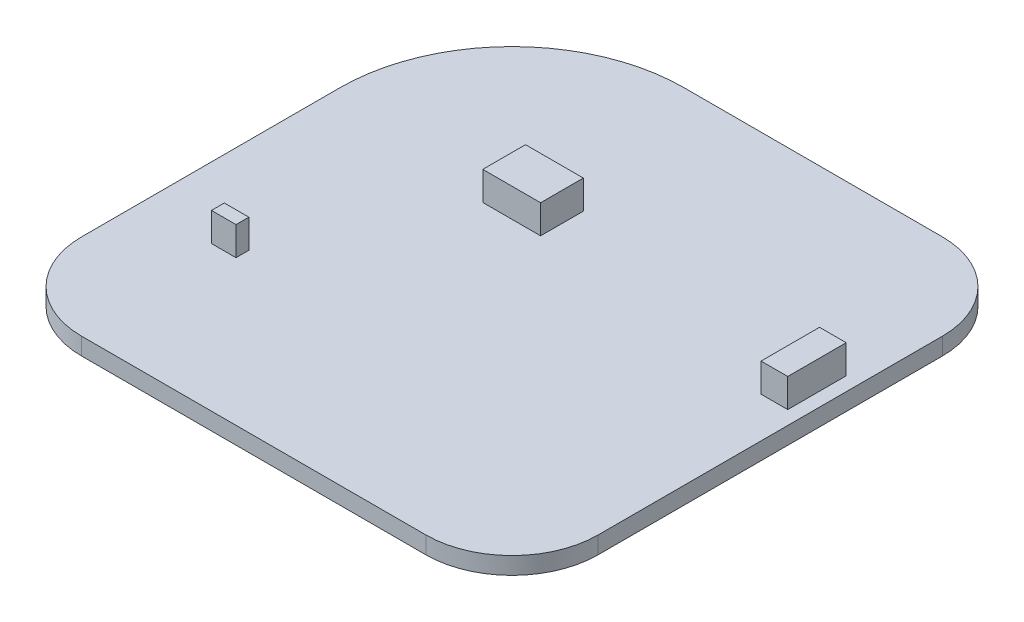
ISO-10303-21;
HEADER;
FILE_DESCRIPTION(('STEP AP214'),'2;1');
FILE_NAME('part.step','',(''),(''),'','','');
FILE_SCHEMA(('AUTOMOTIVE_DESIGN { 1 0 10303 214 1 1 1 1 }'));
ENDSEC;
DATA;
#1=APPLICATION_CONTEXT('core data for automotive mechanical design processes');
#2=APPLICATION_PROTOCOL_DEFINITION('international standard','automotive_design',2000,#1);
#3=PRODUCT_CONTEXT('',#1,'mechanical');
#4=PRODUCT('Part','Part','',(#3));
#5=PRODUCT_RELATED_PRODUCT_CATEGORY('part','',(#4));
#6=PRODUCT_DEFINITION_FORMATION('','',#4);
#7=PRODUCT_DEFINITION_CONTEXT('part definition',#1,'design');
#8=PRODUCT_DEFINITION('design','',#6,#7);
#9=PRODUCT_DEFINITION_SHAPE('','',#8);
#10=(LENGTH_UNIT() NAMED_UNIT(*) SI_UNIT(.MILLI.,.METRE.));
#11=(NAMED_UNIT(*) PLANE_ANGLE_UNIT() SI_UNIT($,.RADIAN.));
#12=(NAMED_UNIT(*) SI_UNIT($,.STERADIAN.) SOLID_ANGLE_UNIT());
#13=UNCERTAINTY_MEASURE_WITH_UNIT(LENGTH_MEASURE(1.E-05),#10,'distance_accuracy_value','');
#14=(GEOMETRIC_REPRESENTATION_CONTEXT(3) GLOBAL_UNCERTAINTY_ASSIGNED_CONTEXT((#13)) GLOBAL_UNIT_ASSIGNED_CONTEXT((#10,
#11,#12)) REPRESENTATION_CONTEXT('',''));
#15=CARTESIAN_POINT('',(0.,0.,0.));
#16=DIRECTION('',(0.,0.,1.));
#17=DIRECTION('',(1.,0.,0.));
#18=AXIS2_PLACEMENT_3D('',#15,#16,#17);
#19=CARTESIAN_POINT('',(-8.95373992154277,1.9,-8.95373992154277));
#20=DIRECTION('',(0.,1.,0.));
#21=DIRECTION('',(0.,0.,1.));
#22=AXIS2_PLACEMENT_3D('',#19,#20,#21);
#23=PLANE('',#22);
#24=CARTESIAN_POINT('',(-8.95373992154277,1.9,-8.95373992154277));
#25=DIRECTION('',(0.,1.,0.));
#26=DIRECTION('',(0.,0.,1.));
#27=AXIS2_PLACEMENT_3D('',#24,#25,#26);
#28=CIRCLE('',#27,18.);
#29=CARTESIAN_POINT('',(-8.95373992154277,1.9,-26.9537399215428));
#30=VERTEX_POINT('',#29);
#31=CARTESIAN_POINT('',(-26.9537399215428,1.9,-8.95373992154277));
#32=VERTEX_POINT('',#31);
#33=EDGE_CURVE('E272',#30,#32,#28,.T.);
#34=ORIENTED_EDGE('',*,*,#33,.T.);
#35=DIRECTION('',(0.,0.,1.));
#36=VECTOR('',#35,1.);
#37=CARTESIAN_POINT('',(-26.9537399215428,1.9,-8.95373992154277));
#38=LINE('',#37,#36);
#39=CARTESIAN_POINT('',(-26.9537399215428,1.9,18.0462600784572));
#40=VERTEX_POINT('',#39);
#41=EDGE_CURVE('E275',#32,#40,#38,.T.);
#42=ORIENTED_EDGE('',*,*,#41,.T.);
#43=CARTESIAN_POINT('',(-17.9537399215428,1.9,18.0462600784572));
#44=DIRECTION('',(0.,1.,0.));
#45=DIRECTION('',(0.,0.,1.));
#46=AXIS2_PLACEMENT_3D('',#43,#44,#45);
#47=CIRCLE('',#46,9.);
#48=CARTESIAN_POINT('',(-17.9537399215428,1.9,27.0462600784572));
#49=VERTEX_POINT('',#48);
#50=EDGE_CURVE('E278',#40,#49,#47,.T.);
#51=ORIENTED_EDGE('',*,*,#50,.T.);
#52=DIRECTION('',(1.,0.,0.));
#53=VECTOR('',#52,1.);
#54=CARTESIAN_POINT('',(-17.9537399215428,1.9,27.0462600784572));
#55=LINE('',#54,#53);
#56=CARTESIAN_POINT('',(18.0462600784572,1.9,27.0462600784572));
#57=VERTEX_POINT('',#56);
#58=EDGE_CURVE('E280',#49,#57,#55,.T.);
#59=ORIENTED_EDGE('',*,*,#58,.T.);
#60=CARTESIAN_POINT('',(18.0462600784572,1.9,18.0462600784572));
#61=DIRECTION('',(0.,1.,0.));
#62=DIRECTION('',(0.,0.,1.));
#63=AXIS2_PLACEMENT_3D('',#60,#61,#62);
#64=CIRCLE('',#63,8.99999999999999);
#65=CARTESIAN_POINT('',(27.0462600784572,1.9,18.0462600784572));
#66=VERTEX_POINT('',#65);
#67=EDGE_CURVE('E282',#57,#66,#64,.T.);
#68=ORIENTED_EDGE('',*,*,#67,.T.);
#69=DIRECTION('',(0.,0.,-1.));
#70=VECTOR('',#69,1.);
#71=CARTESIAN_POINT('',(27.0462600784572,1.9,-17.9537399215428));
#72=LINE('',#71,#70);
#73=CARTESIAN_POINT('',(27.0462600784572,1.9,-17.9537399215428));
#74=VERTEX_POINT('',#73);
#75=EDGE_CURVE('E284',#66,#74,#72,.T.);
#76=ORIENTED_EDGE('',*,*,#75,.T.);
#77=CARTESIAN_POINT('',(18.0462600784572,1.9,-17.9537399215428));
#78=DIRECTION('',(0.,1.,0.));
#79=DIRECTION('',(0.,0.,-1.));
#80=AXIS2_PLACEMENT_3D('',#77,#78,#79);
#81=CIRCLE('',#80,9.);
#82=CARTESIAN_POINT('',(18.0462600784572,1.9,-26.9537399215428));
#83=VERTEX_POINT('',#82);
#84=EDGE_CURVE('E286',#74,#83,#81,.T.);
#85=ORIENTED_EDGE('',*,*,#84,.T.);
#86=DIRECTION('',(-1.,0.,0.));
#87=VECTOR('',#86,1.);
#88=CARTESIAN_POINT('',(-8.95373992154277,1.9,-26.9537399215428));
#89=LINE('',#88,#87);
#90=EDGE_CURVE('E288',#83,#30,#89,.T.);
#91=ORIENTED_EDGE('',*,*,#90,.T.);
#92=EDGE_LOOP('',(#34,#42,#51,#59,#68,#76,#85,#91));
#93=FACE_BOUND('',#92,.T.);
#94=DIRECTION('',(-1.,0.,0.));
#95=VECTOR('',#94,1.);
#96=CARTESIAN_POINT('',(-3.04533557556397,1.9,-10.5049180389187));
#97=LINE('',#96,#95);
#98=CARTESIAN_POINT('',(-3.04533557556397,1.9,-10.5049180389187));
#99=VERTEX_POINT('',#98);
#100=CARTESIAN_POINT('',(-9.09211478915495,1.9,-10.5049180389187));
#101=VERTEX_POINT('',#100);
#102=EDGE_CURVE('E256',#99,#101,#97,.T.);
#103=ORIENTED_EDGE('',*,*,#102,.F.);
#104=DIRECTION('',(0.,0.,-1.));
#105=VECTOR('',#104,1.);
#106=CARTESIAN_POINT('',(-3.04533557556397,1.9,-10.5049180389187));
#107=LINE('',#106,#105);
#108=CARTESIAN_POINT('',(-3.04533557556397,1.9,-6.0361416342829));
#109=VERTEX_POINT('',#108);
#110=EDGE_CURVE('E242',#109,#99,#107,.T.);
#111=ORIENTED_EDGE('',*,*,#110,.F.);
#112=DIRECTION('',(1.,0.,0.));
#113=VECTOR('',#112,1.);
#114=CARTESIAN_POINT('',(-3.04533557556397,1.9,-6.0361416342829));
#115=LINE('',#114,#113);
#116=CARTESIAN_POINT('',(-9.09211478915495,1.9,-6.0361416342829));
#117=VERTEX_POINT('',#116);
#118=EDGE_CURVE('E247',#117,#109,#115,.T.);
#119=ORIENTED_EDGE('',*,*,#118,.F.);
#120=DIRECTION('',(0.,0.,1.));
#121=VECTOR('',#120,1.);
#122=CARTESIAN_POINT('',(-9.09211478915495,1.9,-10.5049180389187));
#123=LINE('',#122,#121);
#124=EDGE_CURVE('E258',#101,#117,#123,.T.);
#125=ORIENTED_EDGE('',*,*,#124,.F.);
#126=EDGE_LOOP('',(#103,#111,#119,#125));
#127=FACE_BOUND('',#126,.T.);
#128=DIRECTION('',(-1.,0.,0.));
#129=VECTOR('',#128,1.);
#130=CARTESIAN_POINT('',(25.6075071904434,1.9,-9.33895941673768));
#131=LINE('',#130,#129);
#132=CARTESIAN_POINT('',(25.6075071904434,1.9,-9.33895941673768));
#133=VERTEX_POINT('',#132);
#134=CARTESIAN_POINT('',(22.8171096144365,1.9,-9.33895941673768));
#135=VERTEX_POINT('',#134);
#136=EDGE_CURVE('E214',#133,#135,#131,.T.);
#137=ORIENTED_EDGE('',*,*,#136,.F.);
#138=DIRECTION('',(0.,0.,-1.));
#139=VECTOR('',#138,1.);
#140=CARTESIAN_POINT('',(25.6075071904434,1.9,-9.33895941673768));
#141=LINE('',#140,#139);
#142=CARTESIAN_POINT('',(25.6075071904434,1.9,-3.2235961309226));
#143=VERTEX_POINT('',#142);
#144=EDGE_CURVE('E211',#143,#133,#141,.T.);
#145=ORIENTED_EDGE('',*,*,#144,.F.);
#146=DIRECTION('',(1.,0.,0.));
#147=VECTOR('',#146,1.);
#148=CARTESIAN_POINT('',(25.6075071904434,1.9,-3.2235961309226));
#149=LINE('',#148,#147);
#150=CARTESIAN_POINT('',(22.8171096144365,1.9,-3.2235961309226));
#151=VERTEX_POINT('',#150);
#152=EDGE_CURVE('E223',#151,#143,#149,.T.);
#153=ORIENTED_EDGE('',*,*,#152,.F.);
#154=DIRECTION('',(0.,0.,1.));
#155=VECTOR('',#154,1.);
#156=CARTESIAN_POINT('',(22.8171096144365,1.9,-9.33895941673768));
#157=LINE('',#156,#155);
#158=EDGE_CURVE('E231',#135,#151,#157,.T.);
#159=ORIENTED_EDGE('',*,*,#158,.F.);
#160=EDGE_LOOP('',(#137,#145,#153,#159));
#161=FACE_BOUND('',#160,.T.);
#162=DIRECTION('',(1.,0.,0.));
#163=VECTOR('',#162,1.);
#164=CARTESIAN_POINT('',(-19.5587865009088,1.9,11.8699083065934));
#165=LINE('',#164,#163);
#166=CARTESIAN_POINT('',(-19.5587865009088,1.9,11.8699083065934));
#167=VERTEX_POINT('',#166);
#168=CARTESIAN_POINT('',(-16.992674790913,1.9,11.8699083065934));
#169=VERTEX_POINT('',#168);
#170=EDGE_CURVE('E591',#167,#169,#165,.T.);
#171=ORIENTED_EDGE('',*,*,#170,.F.);
#172=DIRECTION('',(0.,0.,1.));
#173=VECTOR('',#172,1.);
#174=CARTESIAN_POINT('',(-19.5587865009088,1.9,10.5237147181043));
#175=LINE('',#174,#173);
#176=CARTESIAN_POINT('',(-19.5587865009088,1.9,10.5237147181043));
#177=VERTEX_POINT('',#176);
#178=EDGE_CURVE('E209',#177,#167,#175,.T.);
#179=ORIENTED_EDGE('',*,*,#178,.F.);
#180=DIRECTION('',(-1.,0.,0.));
#181=VECTOR('',#180,1.);
#182=CARTESIAN_POINT('',(-19.5587865009088,1.9,10.5237147181043));
#183=LINE('',#182,#181);
#184=CARTESIAN_POINT('',(-16.992674790913,1.9,10.5237147181043));
#185=VERTEX_POINT('',#184);
#186=EDGE_CURVE('E205',#185,#177,#183,.T.);
#187=ORIENTED_EDGE('',*,*,#186,.F.);
#188=DIRECTION('',(0.,0.,-1.));
#189=VECTOR('',#188,1.);
#190=CARTESIAN_POINT('',(-16.992674790913,1.9,10.5237147181043));
#191=LINE('',#190,#189);
#192=EDGE_CURVE('E588',#169,#185,#191,.T.);
#193=ORIENTED_EDGE('',*,*,#192,.F.);
#194=EDGE_LOOP('',(#171,#179,#187,#193));
#195=FACE_BOUND('',#194,.T.);
#196=ADVANCED_FACE('F48',(#93,#127,#161,#195),#23,.T.);
#197=CARTESIAN_POINT('',(-8.95373992154277,1.9,-8.95373992154277));
#198=DIRECTION('',(0.,-1.,0.));
#199=DIRECTION('',(0.,0.,-1.));
#200=AXIS2_PLACEMENT_3D('',#197,#198,#199);
#201=CYLINDRICAL_SURFACE('',#200,18.);
#202=CARTESIAN_POINT('',(-8.95373992154277,0.1,-8.95373992154277));
#203=DIRECTION('',(0.,1.,0.));
#204=DIRECTION('',(0.,0.,1.));
#205=AXIS2_PLACEMENT_3D('',#202,#203,#204);
#206=CIRCLE('',#205,18.);
#207=CARTESIAN_POINT('',(-8.95373992154277,0.1,-26.9537399215428));
#208=VERTEX_POINT('',#207);
#209=CARTESIAN_POINT('',(-26.9537399215428,0.1,-8.95373992154277));
#210=VERTEX_POINT('',#209);
#211=EDGE_CURVE('E271',#208,#210,#206,.T.);
#212=ORIENTED_EDGE('',*,*,#211,.T.);
#213=DIRECTION('',(0.,-1.,0.));
#214=VECTOR('',#213,1.);
#215=CARTESIAN_POINT('',(-26.9537399215428,1.9,-8.95373992154277));
#216=LINE('',#215,#214);
#217=EDGE_CURVE('E13',#32,#210,#216,.T.);
#218=ORIENTED_EDGE('',*,*,#217,.F.);
#219=ORIENTED_EDGE('',*,*,#33,.F.);
#220=DIRECTION('',(0.,-1.,0.));
#221=VECTOR('',#220,1.);
#222=CARTESIAN_POINT('',(-8.95373992154277,1.9,-26.9537399215428));
#223=LINE('',#222,#221);
#224=EDGE_CURVE('E290',#30,#208,#223,.T.);
#225=ORIENTED_EDGE('',*,*,#224,.T.);
#226=EDGE_LOOP('',(#212,#218,#219,#225));
#227=FACE_BOUND('',#226,.T.);
#228=ADVANCED_FACE('F50',(#227),#201,.T.);
#229=CARTESIAN_POINT('',(-26.9537399215428,1.9,-8.95373992154277));
#230=DIRECTION('',(1.,0.,0.));
#231=DIRECTION('',(0.,0.,-1.));
#232=AXIS2_PLACEMENT_3D('',#229,#230,#231);
#233=PLANE('',#232);
#234=DIRECTION('',(0.,0.,1.));
#235=VECTOR('',#234,1.);
#236=CARTESIAN_POINT('',(-26.9537399215428,0.1,-8.95373992154277));
#237=LINE('',#236,#235);
#238=CARTESIAN_POINT('',(-26.9537399215428,0.1,18.0462600784572));
#239=VERTEX_POINT('',#238);
#240=EDGE_CURVE('E293',#210,#239,#237,.T.);
#241=ORIENTED_EDGE('',*,*,#240,.T.);
#242=DIRECTION('',(0.,-1.,0.));
#243=VECTOR('',#242,1.);
#244=CARTESIAN_POINT('',(-26.9537399215428,1.9,18.0462600784572));
#245=LINE('',#244,#243);
#246=EDGE_CURVE('E56',#40,#239,#245,.T.);
#247=ORIENTED_EDGE('',*,*,#246,.F.);
#248=ORIENTED_EDGE('',*,*,#41,.F.);
#249=ORIENTED_EDGE('',*,*,#217,.T.);
#250=EDGE_LOOP('',(#241,#247,#248,#249));
#251=FACE_BOUND('',#250,.T.);
#252=ADVANCED_FACE('F350',(#251),#233,.F.);
#253=CARTESIAN_POINT('',(-17.9537399215428,1.9,18.0462600784572));
#254=DIRECTION('',(0.,-1.,0.));
#255=DIRECTION('',(0.,0.,-1.));
#256=AXIS2_PLACEMENT_3D('',#253,#254,#255);
#257=CYLINDRICAL_SURFACE('',#256,9.);
#258=CARTESIAN_POINT('',(-17.9537399215428,0.1,18.0462600784572));
#259=DIRECTION('',(0.,1.,0.));
#260=DIRECTION('',(0.,0.,1.));
#261=AXIS2_PLACEMENT_3D('',#258,#259,#260);
#262=CIRCLE('',#261,9.);
#263=CARTESIAN_POINT('',(-17.9537399215428,0.1,27.0462600784572));
#264=VERTEX_POINT('',#263);
#265=EDGE_CURVE('E295',#239,#264,#262,.T.);
#266=ORIENTED_EDGE('',*,*,#265,.T.);
#267=DIRECTION('',(0.,-1.,0.));
#268=VECTOR('',#267,1.);
#269=CARTESIAN_POINT('',(-17.9537399215428,1.9,27.0462600784572));
#270=LINE('',#269,#268);
#271=EDGE_CURVE('E320',#49,#264,#270,.T.);
#272=ORIENTED_EDGE('',*,*,#271,.F.);
#273=ORIENTED_EDGE('',*,*,#50,.F.);
#274=ORIENTED_EDGE('',*,*,#246,.T.);
#275=EDGE_LOOP('',(#266,#272,#273,#274));
#276=FACE_BOUND('',#275,.T.);
#277=ADVANCED_FACE('F327',(#276),#257,.T.);
#278=CARTESIAN_POINT('',(-17.9537399215428,1.9,27.0462600784572));
#279=DIRECTION('',(0.,0.,-1.));
#280=DIRECTION('',(-1.,0.,0.));
#281=AXIS2_PLACEMENT_3D('',#278,#279,#280);
#282=PLANE('',#281);
#283=DIRECTION('',(1.,0.,0.));
#284=VECTOR('',#283,1.);
#285=CARTESIAN_POINT('',(-17.9537399215428,0.1,27.0462600784572));
#286=LINE('',#285,#284);
#287=CARTESIAN_POINT('',(18.0462600784572,0.1,27.0462600784572));
#288=VERTEX_POINT('',#287);
#289=EDGE_CURVE('E297',#264,#288,#286,.T.);
#290=ORIENTED_EDGE('',*,*,#289,.T.);
#291=DIRECTION('',(0.,-1.,0.));
#292=VECTOR('',#291,1.);
#293=CARTESIAN_POINT('',(18.0462600784572,1.9,27.0462600784572));
#294=LINE('',#293,#292);
#295=EDGE_CURVE('E317',#57,#288,#294,.T.);
#296=ORIENTED_EDGE('',*,*,#295,.F.);
#297=ORIENTED_EDGE('',*,*,#58,.F.);
#298=ORIENTED_EDGE('',*,*,#271,.T.);
#299=EDGE_LOOP('',(#290,#296,#297,#298));
#300=FACE_BOUND('',#299,.T.);
#301=ADVANCED_FACE('F338',(#300),#282,.F.);
#302=CARTESIAN_POINT('',(18.0462600784572,1.9,18.0462600784572));
#303=DIRECTION('',(0.,-1.,0.));
#304=DIRECTION('',(0.,0.,-1.));
#305=AXIS2_PLACEMENT_3D('',#302,#303,#304);
#306=CYLINDRICAL_SURFACE('',#305,8.99999999999999);
#307=CARTESIAN_POINT('',(18.0462600784572,0.1,18.0462600784572));
#308=DIRECTION('',(0.,1.,0.));
#309=DIRECTION('',(0.,0.,1.));
#310=AXIS2_PLACEMENT_3D('',#307,#308,#309);
#311=CIRCLE('',#310,8.99999999999999);
#312=CARTESIAN_POINT('',(27.0462600784572,0.1,18.0462600784572));
#313=VERTEX_POINT('',#312);
#314=EDGE_CURVE('E299',#288,#313,#311,.T.);
#315=ORIENTED_EDGE('',*,*,#314,.T.);
#316=DIRECTION('',(0.,-1.,0.));
#317=VECTOR('',#316,1.);
#318=CARTESIAN_POINT('',(27.0462600784572,1.9,18.0462600784572));
#319=LINE('',#318,#317);
#320=EDGE_CURVE('E314',#66,#313,#319,.T.);
#321=ORIENTED_EDGE('',*,*,#320,.F.);
#322=ORIENTED_EDGE('',*,*,#67,.F.);
#323=ORIENTED_EDGE('',*,*,#295,.T.);
#324=EDGE_LOOP('',(#315,#321,#322,#323));
#325=FACE_BOUND('',#324,.T.);
#326=ADVANCED_FACE('F342',(#325),#306,.T.);
#327=CARTESIAN_POINT('',(27.0462600784572,1.9,-17.9537399215428));
#328=DIRECTION('',(-1.,0.,0.));
#329=DIRECTION('',(0.,0.,1.));
#330=AXIS2_PLACEMENT_3D('',#327,#328,#329);
#331=PLANE('',#330);
#332=DIRECTION('',(0.,0.,-1.));
#333=VECTOR('',#332,1.);
#334=CARTESIAN_POINT('',(27.0462600784572,0.1,-17.9537399215428));
#335=LINE('',#334,#333);
#336=CARTESIAN_POINT('',(27.0462600784572,0.1,-17.9537399215428));
#337=VERTEX_POINT('',#336);
#338=EDGE_CURVE('E301',#313,#337,#335,.T.);
#339=ORIENTED_EDGE('',*,*,#338,.T.);
#340=DIRECTION('',(0.,-1.,0.));
#341=VECTOR('',#340,1.);
#342=CARTESIAN_POINT('',(27.0462600784572,1.9,-17.9537399215428));
#343=LINE('',#342,#341);
#344=EDGE_CURVE('E311',#74,#337,#343,.T.);
#345=ORIENTED_EDGE('',*,*,#344,.F.);
#346=ORIENTED_EDGE('',*,*,#75,.F.);
#347=ORIENTED_EDGE('',*,*,#320,.T.);
#348=EDGE_LOOP('',(#339,#345,#346,#347));
#349=FACE_BOUND('',#348,.T.);
#350=ADVANCED_FACE('F363',(#349),#331,.F.);
#351=CARTESIAN_POINT('',(18.0462600784572,1.9,-17.9537399215428));
#352=DIRECTION('',(0.,-1.,0.));
#353=DIRECTION('',(0.,0.,-1.));
#354=AXIS2_PLACEMENT_3D('',#351,#352,#353);
#355=CYLINDRICAL_SURFACE('',#354,9.);
#356=CARTESIAN_POINT('',(18.0462600784572,0.1,-17.9537399215428));
#357=DIRECTION('',(0.,1.,0.));
#358=DIRECTION('',(0.,0.,-1.));
#359=AXIS2_PLACEMENT_3D('',#356,#357,#358);
#360=CIRCLE('',#359,9.);
#361=CARTESIAN_POINT('',(18.0462600784572,0.1,-26.9537399215428));
#362=VERTEX_POINT('',#361);
#363=EDGE_CURVE('E303',#337,#362,#360,.T.);
#364=ORIENTED_EDGE('',*,*,#363,.T.);
#365=DIRECTION('',(0.,-1.,0.));
#366=VECTOR('',#365,1.);
#367=CARTESIAN_POINT('',(18.0462600784572,1.9,-26.9537399215428));
#368=LINE('',#367,#366);
#369=EDGE_CURVE('E308',#83,#362,#368,.T.);
#370=ORIENTED_EDGE('',*,*,#369,.F.);
#371=ORIENTED_EDGE('',*,*,#84,.F.);
#372=ORIENTED_EDGE('',*,*,#344,.T.);
#373=EDGE_LOOP('',(#364,#370,#371,#372));
#374=FACE_BOUND('',#373,.T.);
#375=ADVANCED_FACE('F361',(#374),#355,.T.);
#376=CARTESIAN_POINT('',(-8.95373992154277,1.9,-26.9537399215428));
#377=DIRECTION('',(0.,0.,1.));
#378=DIRECTION('',(1.,0.,0.));
#379=AXIS2_PLACEMENT_3D('',#376,#377,#378);
#380=PLANE('',#379);
#381=DIRECTION('',(-1.,0.,0.));
#382=VECTOR('',#381,1.);
#383=CARTESIAN_POINT('',(-8.95373992154277,0.1,-26.9537399215428));
#384=LINE('',#383,#382);
#385=EDGE_CURVE('E276',#362,#208,#384,.T.);
#386=ORIENTED_EDGE('',*,*,#385,.T.);
#387=ORIENTED_EDGE('',*,*,#224,.F.);
#388=ORIENTED_EDGE('',*,*,#90,.F.);
#389=ORIENTED_EDGE('',*,*,#369,.T.);
#390=EDGE_LOOP('',(#386,#387,#388,#389));
#391=FACE_BOUND('',#390,.T.);
#392=ADVANCED_FACE('F356',(#391),#380,.F.);
#393=CARTESIAN_POINT('',(-8.95373992154277,0.1,-8.95373992154277));
#394=DIRECTION('',(0.,1.,0.));
#395=DIRECTION('',(0.,0.,1.));
#396=AXIS2_PLACEMENT_3D('',#393,#394,#395);
#397=PLANE('',#396);
#398=ORIENTED_EDGE('',*,*,#211,.F.);
#399=ORIENTED_EDGE('',*,*,#385,.F.);
#400=ORIENTED_EDGE('',*,*,#363,.F.);
#401=ORIENTED_EDGE('',*,*,#338,.F.);
#402=ORIENTED_EDGE('',*,*,#314,.F.);
#403=ORIENTED_EDGE('',*,*,#289,.F.);
#404=ORIENTED_EDGE('',*,*,#265,.F.);
#405=ORIENTED_EDGE('',*,*,#240,.F.);
#406=EDGE_LOOP('',(#398,#399,#400,#401,#402,#403,#404,#405));
#407=FACE_BOUND('',#406,.T.);
#408=ADVANCED_FACE('F333',(#407),#397,.F.);
#409=CARTESIAN_POINT('',(-3.04533557556397,4.9,-10.5049180389187));
#410=DIRECTION('',(-1.,0.,0.));
#411=DIRECTION('',(0.,0.,1.));
#412=AXIS2_PLACEMENT_3D('',#409,#410,#411);
#413=PLANE('',#412);
#414=ORIENTED_EDGE('',*,*,#110,.T.);
#415=DIRECTION('',(0.,-1.,0.));
#416=VECTOR('',#415,1.);
#417=CARTESIAN_POINT('',(-3.04533557556397,4.9,-10.5049180389187));
#418=LINE('',#417,#416);
#419=CARTESIAN_POINT('',(-3.04533557556397,4.9,-10.5049180389187));
#420=VERTEX_POINT('',#419);
#421=EDGE_CURVE('E269',#420,#99,#418,.T.);
#422=ORIENTED_EDGE('',*,*,#421,.F.);
#423=DIRECTION('',(0.,0.,-1.));
#424=VECTOR('',#423,1.);
#425=CARTESIAN_POINT('',(-3.04533557556397,4.9,-10.5049180389187));
#426=LINE('',#425,#424);
#427=CARTESIAN_POINT('',(-3.04533557556397,4.9,-6.0361416342829));
#428=VERTEX_POINT('',#427);
#429=EDGE_CURVE('E243',#428,#420,#426,.T.);
#430=ORIENTED_EDGE('',*,*,#429,.F.);
#431=DIRECTION('',(0.,-1.,0.));
#432=VECTOR('',#431,1.);
#433=CARTESIAN_POINT('',(-3.04533557556397,4.9,-6.0361416342829));
#434=LINE('',#433,#432);
#435=EDGE_CURVE('E253',#428,#109,#434,.T.);
#436=ORIENTED_EDGE('',*,*,#435,.T.);
#437=EDGE_LOOP('',(#414,#422,#430,#436));
#438=FACE_BOUND('',#437,.T.);
#439=ADVANCED_FACE('F379',(#438),#413,.F.);
#440=CARTESIAN_POINT('',(-3.04533557556397,4.9,-10.5049180389187));
#441=DIRECTION('',(0.,0.,1.));
#442=DIRECTION('',(1.,0.,0.));
#443=AXIS2_PLACEMENT_3D('',#440,#441,#442);
#444=PLANE('',#443);
#445=ORIENTED_EDGE('',*,*,#102,.T.);
#446=DIRECTION('',(0.,-1.,0.));
#447=VECTOR('',#446,1.);
#448=CARTESIAN_POINT('',(-9.09211478915495,4.9,-10.5049180389187));
#449=LINE('',#448,#447);
#450=CARTESIAN_POINT('',(-9.09211478915495,4.9,-10.5049180389187));
#451=VERTEX_POINT('',#450);
#452=EDGE_CURVE('E266',#451,#101,#449,.T.);
#453=ORIENTED_EDGE('',*,*,#452,.F.);
#454=DIRECTION('',(-1.,0.,0.));
#455=VECTOR('',#454,1.);
#456=CARTESIAN_POINT('',(-3.04533557556397,4.9,-10.5049180389187));
#457=LINE('',#456,#455);
#458=EDGE_CURVE('E246',#420,#451,#457,.T.);
#459=ORIENTED_EDGE('',*,*,#458,.F.);
#460=ORIENTED_EDGE('',*,*,#421,.T.);
#461=EDGE_LOOP('',(#445,#453,#459,#460));
#462=FACE_BOUND('',#461,.T.);
#463=ADVANCED_FACE('F398',(#462),#444,.F.);
#464=CARTESIAN_POINT('',(-9.09211478915495,4.9,-10.5049180389187));
#465=DIRECTION('',(1.,0.,0.));
#466=DIRECTION('',(0.,0.,-1.));
#467=AXIS2_PLACEMENT_3D('',#464,#465,#466);
#468=PLANE('',#467);
#469=ORIENTED_EDGE('',*,*,#124,.T.);
#470=DIRECTION('',(0.,-1.,0.));
#471=VECTOR('',#470,1.);
#472=CARTESIAN_POINT('',(-9.09211478915495,4.9,-6.0361416342829));
#473=LINE('',#472,#471);
#474=CARTESIAN_POINT('',(-9.09211478915495,4.9,-6.0361416342829));
#475=VERTEX_POINT('',#474);
#476=EDGE_CURVE('E264',#475,#117,#473,.T.);
#477=ORIENTED_EDGE('',*,*,#476,.F.);
#478=DIRECTION('',(0.,0.,1.));
#479=VECTOR('',#478,1.);
#480=CARTESIAN_POINT('',(-9.09211478915495,4.9,-10.5049180389187));
#481=LINE('',#480,#479);
#482=EDGE_CURVE('E249',#451,#475,#481,.T.);
#483=ORIENTED_EDGE('',*,*,#482,.F.);
#484=ORIENTED_EDGE('',*,*,#452,.T.);
#485=EDGE_LOOP('',(#469,#477,#483,#484));
#486=FACE_BOUND('',#485,.T.);
#487=ADVANCED_FACE('F405',(#486),#468,.F.);
#488=CARTESIAN_POINT('',(-3.04533557556397,4.9,-6.0361416342829));
#489=DIRECTION('',(0.,0.,-1.));
#490=DIRECTION('',(-1.,0.,0.));
#491=AXIS2_PLACEMENT_3D('',#488,#489,#490);
#492=PLANE('',#491);
#493=ORIENTED_EDGE('',*,*,#118,.T.);
#494=ORIENTED_EDGE('',*,*,#435,.F.);
#495=DIRECTION('',(1.,0.,0.));
#496=VECTOR('',#495,1.);
#497=CARTESIAN_POINT('',(-3.04533557556397,4.9,-6.0361416342829));
#498=LINE('',#497,#496);
#499=EDGE_CURVE('E251',#475,#428,#498,.T.);
#500=ORIENTED_EDGE('',*,*,#499,.F.);
#501=ORIENTED_EDGE('',*,*,#476,.T.);
#502=EDGE_LOOP('',(#493,#494,#500,#501));
#503=FACE_BOUND('',#502,.T.);
#504=ADVANCED_FACE('F412',(#503),#492,.F.);
#505=CARTESIAN_POINT('',(0.,4.9,0.));
#506=DIRECTION('',(0.,-1.,0.));
#507=DIRECTION('',(0.,0.,-1.));
#508=AXIS2_PLACEMENT_3D('',#505,#506,#507);
#509=PLANE('',#508);
#510=ORIENTED_EDGE('',*,*,#429,.T.);
#511=ORIENTED_EDGE('',*,*,#458,.T.);
#512=ORIENTED_EDGE('',*,*,#482,.T.);
#513=ORIENTED_EDGE('',*,*,#499,.T.);
#514=EDGE_LOOP('',(#510,#511,#512,#513));
#515=FACE_BOUND('',#514,.T.);
#516=ADVANCED_FACE('F420',(#515),#509,.F.);
#517=CARTESIAN_POINT('',(25.6075071904434,4.9,-9.33895941673768));
#518=DIRECTION('',(-1.,0.,0.));
#519=DIRECTION('',(0.,0.,1.));
#520=AXIS2_PLACEMENT_3D('',#517,#518,#519);
#521=PLANE('',#520);
#522=ORIENTED_EDGE('',*,*,#144,.T.);
#523=DIRECTION('',(0.,-1.,0.));
#524=VECTOR('',#523,1.);
#525=CARTESIAN_POINT('',(25.6075071904434,4.9,-9.33895941673768));
#526=LINE('',#525,#524);
#527=CARTESIAN_POINT('',(25.6075071904434,4.9,-9.33895941673768));
#528=VERTEX_POINT('',#527);
#529=EDGE_CURVE('E240',#528,#133,#526,.T.);
#530=ORIENTED_EDGE('',*,*,#529,.F.);
#531=DIRECTION('',(0.,0.,-1.));
#532=VECTOR('',#531,1.);
#533=CARTESIAN_POINT('',(25.6075071904434,4.9,-9.33895941673768));
#534=LINE('',#533,#532);
#535=CARTESIAN_POINT('',(25.6075071904434,4.9,-3.2235961309226));
#536=VERTEX_POINT('',#535);
#537=EDGE_CURVE('E219',#536,#528,#534,.T.);
#538=ORIENTED_EDGE('',*,*,#537,.F.);
#539=DIRECTION('',(0.,-1.,0.));
#540=VECTOR('',#539,1.);
#541=CARTESIAN_POINT('',(25.6075071904434,4.9,-3.2235961309226));
#542=LINE('',#541,#540);
#543=EDGE_CURVE('E228',#536,#143,#542,.T.);
#544=ORIENTED_EDGE('',*,*,#543,.T.);
#545=EDGE_LOOP('',(#522,#530,#538,#544));
#546=FACE_BOUND('',#545,.T.);
#547=ADVANCED_FACE('F428',(#546),#521,.F.);
#548=CARTESIAN_POINT('',(25.6075071904434,4.9,-9.33895941673768));
#549=DIRECTION('',(0.,0.,1.));
#550=DIRECTION('',(1.,0.,0.));
#551=AXIS2_PLACEMENT_3D('',#548,#549,#550);
#552=PLANE('',#551);
#553=ORIENTED_EDGE('',*,*,#136,.T.);
#554=DIRECTION('',(0.,-1.,0.));
#555=VECTOR('',#554,1.);
#556=CARTESIAN_POINT('',(22.8171096144365,4.9,-9.33895941673768));
#557=LINE('',#556,#555);
#558=CARTESIAN_POINT('',(22.8171096144365,4.9,-9.33895941673768));
#559=VERTEX_POINT('',#558);
#560=EDGE_CURVE('E237',#559,#135,#557,.T.);
#561=ORIENTED_EDGE('',*,*,#560,.F.);
#562=DIRECTION('',(-1.,0.,0.));
#563=VECTOR('',#562,1.);
#564=CARTESIAN_POINT('',(25.6075071904434,4.9,-9.33895941673768));
#565=LINE('',#564,#563);
#566=EDGE_CURVE('E222',#528,#559,#565,.T.);
#567=ORIENTED_EDGE('',*,*,#566,.F.);
#568=ORIENTED_EDGE('',*,*,#529,.T.);
#569=EDGE_LOOP('',(#553,#561,#567,#568));
#570=FACE_BOUND('',#569,.T.);
#571=ADVANCED_FACE('F436',(#570),#552,.F.);
#572=CARTESIAN_POINT('',(22.8171096144365,4.9,-9.33895941673768));
#573=DIRECTION('',(1.,0.,0.));
#574=DIRECTION('',(0.,0.,-1.));
#575=AXIS2_PLACEMENT_3D('',#572,#573,#574);
#576=PLANE('',#575);
#577=ORIENTED_EDGE('',*,*,#158,.T.);
#578=DIRECTION('',(0.,-1.,0.));
#579=VECTOR('',#578,1.);
#580=CARTESIAN_POINT('',(22.8171096144365,4.9,-3.2235961309226));
#581=LINE('',#580,#579);
#582=CARTESIAN_POINT('',(22.8171096144365,4.9,-3.2235961309226));
#583=VERTEX_POINT('',#582);
#584=EDGE_CURVE('E71',#583,#151,#581,.T.);
#585=ORIENTED_EDGE('',*,*,#584,.F.);
#586=DIRECTION('',(0.,0.,1.));
#587=VECTOR('',#586,1.);
#588=CARTESIAN_POINT('',(22.8171096144365,4.9,-9.33895941673768));
#589=LINE('',#588,#587);
#590=EDGE_CURVE('E225',#559,#583,#589,.T.);
#591=ORIENTED_EDGE('',*,*,#590,.F.);
#592=ORIENTED_EDGE('',*,*,#560,.T.);
#593=EDGE_LOOP('',(#577,#585,#591,#592));
#594=FACE_BOUND('',#593,.T.);
#595=ADVANCED_FACE('F444',(#594),#576,.F.);
#596=CARTESIAN_POINT('',(25.6075071904434,4.9,-3.2235961309226));
#597=DIRECTION('',(0.,0.,-1.));
#598=DIRECTION('',(-1.,0.,0.));
#599=AXIS2_PLACEMENT_3D('',#596,#597,#598);
#600=PLANE('',#599);
#601=ORIENTED_EDGE('',*,*,#152,.T.);
#602=ORIENTED_EDGE('',*,*,#543,.F.);
#603=DIRECTION('',(1.,0.,0.));
#604=VECTOR('',#603,1.);
#605=CARTESIAN_POINT('',(25.6075071904434,4.9,-3.2235961309226));
#606=LINE('',#605,#604);
#607=EDGE_CURVE('E227',#583,#536,#606,.T.);
#608=ORIENTED_EDGE('',*,*,#607,.F.);
#609=ORIENTED_EDGE('',*,*,#584,.T.);
#610=EDGE_LOOP('',(#601,#602,#608,#609));
#611=FACE_BOUND('',#610,.T.);
#612=ADVANCED_FACE('F452',(#611),#600,.F.);
#613=CARTESIAN_POINT('',(0.,4.9,0.));
#614=DIRECTION('',(0.,-1.,0.));
#615=DIRECTION('',(0.,0.,-1.));
#616=AXIS2_PLACEMENT_3D('',#613,#614,#615);
#617=PLANE('',#616);
#618=ORIENTED_EDGE('',*,*,#537,.T.);
#619=ORIENTED_EDGE('',*,*,#566,.T.);
#620=ORIENTED_EDGE('',*,*,#590,.T.);
#621=ORIENTED_EDGE('',*,*,#607,.T.);
#622=EDGE_LOOP('',(#618,#619,#620,#621));
#623=FACE_BOUND('',#622,.T.);
#624=ADVANCED_FACE('F460',(#623),#617,.F.);
#625=CARTESIAN_POINT('',(-19.5587865009088,4.9,10.5237147181043));
#626=DIRECTION('',(1.,0.,0.));
#627=DIRECTION('',(0.,0.,-1.));
#628=AXIS2_PLACEMENT_3D('',#625,#626,#627);
#629=PLANE('',#628);
#630=ORIENTED_EDGE('',*,*,#178,.T.);
#631=DIRECTION('',(0.,-1.,0.));
#632=VECTOR('',#631,1.);
#633=CARTESIAN_POINT('',(-19.5587865009088,4.9,11.8699083065934));
#634=LINE('',#633,#632);
#635=CARTESIAN_POINT('',(-19.5587865009088,4.9,11.8699083065934));
#636=VERTEX_POINT('',#635);
#637=EDGE_CURVE('E190',#636,#167,#634,.T.);
#638=ORIENTED_EDGE('',*,*,#637,.F.);
#639=DIRECTION('',(0.,0.,1.));
#640=VECTOR('',#639,1.);
#641=CARTESIAN_POINT('',(-19.5587865009088,4.9,10.5237147181043));
#642=LINE('',#641,#640);
#643=CARTESIAN_POINT('',(-19.5587865009088,4.9,10.5237147181043));
#644=VERTEX_POINT('',#643);
#645=EDGE_CURVE('E197',#644,#636,#642,.T.);
#646=ORIENTED_EDGE('',*,*,#645,.F.);
#647=DIRECTION('',(0.,-1.,0.));
#648=VECTOR('',#647,1.);
#649=CARTESIAN_POINT('',(-19.5587865009088,4.9,10.5237147181043));
#650=LINE('',#649,#648);
#651=EDGE_CURVE('E585',#644,#177,#650,.T.);
#652=ORIENTED_EDGE('',*,*,#651,.T.);
#653=EDGE_LOOP('',(#630,#638,#646,#652));
#654=FACE_BOUND('',#653,.T.);
#655=ADVANCED_FACE('F207',(#654),#629,.F.);
#656=CARTESIAN_POINT('',(-19.5587865009088,4.9,11.8699083065934));
#657=DIRECTION('',(0.,0.,-1.));
#658=DIRECTION('',(-1.,0.,0.));
#659=AXIS2_PLACEMENT_3D('',#656,#657,#658);
#660=PLANE('',#659);
#661=ORIENTED_EDGE('',*,*,#170,.T.);
#662=DIRECTION('',(0.,-1.,0.));
#663=VECTOR('',#662,1.);
#664=CARTESIAN_POINT('',(-16.992674790913,4.9,11.8699083065934));
#665=LINE('',#664,#663);
#666=CARTESIAN_POINT('',(-16.992674790913,4.9,11.8699083065934));
#667=VERTEX_POINT('',#666);
#668=EDGE_CURVE('E193',#667,#169,#665,.T.);
#669=ORIENTED_EDGE('',*,*,#668,.F.);
#670=DIRECTION('',(1.,0.,0.));
#671=VECTOR('',#670,1.);
#672=CARTESIAN_POINT('',(-19.5587865009088,4.9,11.8699083065934));
#673=LINE('',#672,#671);
#674=EDGE_CURVE('E186',#636,#667,#673,.T.);
#675=ORIENTED_EDGE('',*,*,#674,.F.);
#676=ORIENTED_EDGE('',*,*,#637,.T.);
#677=EDGE_LOOP('',(#661,#669,#675,#676));
#678=FACE_BOUND('',#677,.T.);
#679=ADVANCED_FACE('F188',(#678),#660,.F.);
#680=CARTESIAN_POINT('',(-16.992674790913,4.9,10.5237147181043));
#681=DIRECTION('',(-1.,0.,0.));
#682=DIRECTION('',(0.,0.,1.));
#683=AXIS2_PLACEMENT_3D('',#680,#681,#682);
#684=PLANE('',#683);
#685=ORIENTED_EDGE('',*,*,#192,.T.);
#686=DIRECTION('',(0.,-1.,0.));
#687=VECTOR('',#686,1.);
#688=CARTESIAN_POINT('',(-16.992674790913,4.9,10.5237147181043));
#689=LINE('',#688,#687);
#690=CARTESIAN_POINT('',(-16.992674790913,4.9,10.5237147181043));
#691=VERTEX_POINT('',#690);
#692=EDGE_CURVE('E63',#691,#185,#689,.T.);
#693=ORIENTED_EDGE('',*,*,#692,.F.);
#694=DIRECTION('',(0.,0.,-1.));
#695=VECTOR('',#694,1.);
#696=CARTESIAN_POINT('',(-16.992674790913,4.9,10.5237147181043));
#697=LINE('',#696,#695);
#698=EDGE_CURVE('E196',#667,#691,#697,.T.);
#699=ORIENTED_EDGE('',*,*,#698,.F.);
#700=ORIENTED_EDGE('',*,*,#668,.T.);
#701=EDGE_LOOP('',(#685,#693,#699,#700));
#702=FACE_BOUND('',#701,.T.);
#703=ADVANCED_FACE('F480',(#702),#684,.F.);
#704=CARTESIAN_POINT('',(-19.5587865009088,4.9,10.5237147181043));
#705=DIRECTION('',(0.,0.,1.));
#706=DIRECTION('',(1.,0.,0.));
#707=AXIS2_PLACEMENT_3D('',#704,#705,#706);
#708=PLANE('',#707);
#709=ORIENTED_EDGE('',*,*,#186,.T.);
#710=ORIENTED_EDGE('',*,*,#651,.F.);
#711=DIRECTION('',(-1.,0.,0.));
#712=VECTOR('',#711,1.);
#713=CARTESIAN_POINT('',(-19.5587865009088,4.9,10.5237147181043));
#714=LINE('',#713,#712);
#715=EDGE_CURVE('E201',#691,#644,#714,.T.);
#716=ORIENTED_EDGE('',*,*,#715,.F.);
#717=ORIENTED_EDGE('',*,*,#692,.T.);
#718=EDGE_LOOP('',(#709,#710,#716,#717));
#719=FACE_BOUND('',#718,.T.);
#720=ADVANCED_FACE('F487',(#719),#708,.F.);
#721=CARTESIAN_POINT('',(0.,4.9,0.));
#722=DIRECTION('',(0.,1.,0.));
#723=DIRECTION('',(0.,0.,1.));
#724=AXIS2_PLACEMENT_3D('',#721,#722,#723);
#725=PLANE('',#724);
#726=ORIENTED_EDGE('',*,*,#645,.T.);
#727=ORIENTED_EDGE('',*,*,#674,.T.);
#728=ORIENTED_EDGE('',*,*,#698,.T.);
#729=ORIENTED_EDGE('',*,*,#715,.T.);
#730=EDGE_LOOP('',(#726,#727,#728,#729));
#731=FACE_BOUND('',#730,.T.);
#732=ADVANCED_FACE('F200',(#731),#725,.T.);
#733=CLOSED_SHELL('',(#196,#228,#252,#277,#301,#326,#350,#375,#392,#408,#439,#463,#487,#504,
#516,#547,#571,#595,#612,#624,#655,#679,#703,#720,#732));
#734=MANIFOLD_SOLID_BREP('B2',#733);
#735=ADVANCED_BREP_SHAPE_REPRESENTATION('',(#18,#734),#14);
#736=SHAPE_DEFINITION_REPRESENTATION(#9,#735);
ENDSEC;
END-ISO-10303-21;
